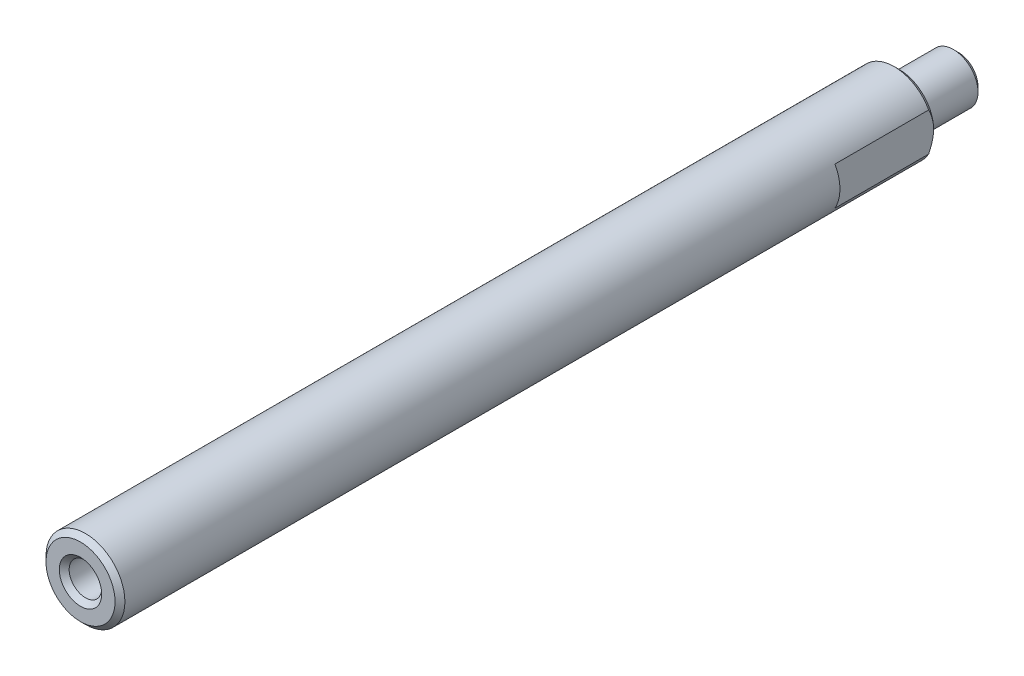
ISO-10303-21;
HEADER;
FILE_DESCRIPTION(('STEP AP214'),'2;1');
FILE_NAME('part.step','',(''),(''),'','','');
FILE_SCHEMA(('AUTOMOTIVE_DESIGN { 1 0 10303 214 1 1 1 1 }'));
ENDSEC;
DATA;
#1=APPLICATION_CONTEXT('core data for automotive mechanical design processes');
#2=APPLICATION_PROTOCOL_DEFINITION('international standard','automotive_design',2000,#1);
#3=PRODUCT_CONTEXT('',#1,'mechanical');
#4=PRODUCT('Part','Part','',(#3));
#5=PRODUCT_RELATED_PRODUCT_CATEGORY('part','',(#4));
#6=PRODUCT_DEFINITION_FORMATION('','',#4);
#7=PRODUCT_DEFINITION_CONTEXT('part definition',#1,'design');
#8=PRODUCT_DEFINITION('design','',#6,#7);
#9=PRODUCT_DEFINITION_SHAPE('','',#8);
#10=(LENGTH_UNIT() NAMED_UNIT(*) SI_UNIT(.MILLI.,.METRE.));
#11=(NAMED_UNIT(*) PLANE_ANGLE_UNIT() SI_UNIT($,.RADIAN.));
#12=(NAMED_UNIT(*) SI_UNIT($,.STERADIAN.) SOLID_ANGLE_UNIT());
#13=UNCERTAINTY_MEASURE_WITH_UNIT(LENGTH_MEASURE(1.E-05),#10,'distance_accuracy_value','');
#14=(GEOMETRIC_REPRESENTATION_CONTEXT(3) GLOBAL_UNCERTAINTY_ASSIGNED_CONTEXT((#13)) GLOBAL_UNIT_ASSIGNED_CONTEXT((#10,
#11,#12)) REPRESENTATION_CONTEXT('',''));
#15=CARTESIAN_POINT('',(0.,0.,0.));
#16=DIRECTION('',(0.,0.,1.));
#17=DIRECTION('',(1.,0.,0.));
#18=AXIS2_PLACEMENT_3D('',#15,#16,#17);
#19=CARTESIAN_POINT('',(0.,0.,41.5));
#20=DIRECTION('',(0.,0.,-1.));
#21=DIRECTION('',(-1.,0.,0.));
#22=AXIS2_PLACEMENT_3D('',#19,#20,#21);
#23=CYLINDRICAL_SURFACE('',#22,4.);
#24=CARTESIAN_POINT('',(0.,0.,41.));
#25=DIRECTION('',(0.,0.,1.));
#26=DIRECTION('',(1.,0.,0.));
#27=AXIS2_PLACEMENT_3D('',#24,#25,#26);
#28=CIRCLE('',#27,4.);
#29=CARTESIAN_POINT('',(4.,0.,41.));
#30=VERTEX_POINT('',#29);
#31=EDGE_CURVE('E212',#30,#30,#28,.F.);
#32=ORIENTED_EDGE('',*,*,#31,.T.);
#33=EDGE_LOOP('',(#32));
#34=FACE_BOUND('',#33,.T.);
#35=DIRECTION('',(0.,0.,-1.));
#36=VECTOR('',#35,1.);
#37=CARTESIAN_POINT('',(3.5,-1.9364916731037,41.5));
#38=LINE('',#37,#36);
#39=CARTESIAN_POINT('',(3.5,-1.9364916731037,-31.5));
#40=VERTEX_POINT('',#39);
#41=CARTESIAN_POINT('',(3.5,-1.9364916731037,-41.));
#42=VERTEX_POINT('',#41);
#43=EDGE_CURVE('E54',#40,#42,#38,.T.);
#44=ORIENTED_EDGE('',*,*,#43,.F.);
#45=CARTESIAN_POINT('',(0.,0.,-31.5));
#46=DIRECTION('',(0.,0.,-1.));
#47=DIRECTION('',(-1.,0.,0.));
#48=AXIS2_PLACEMENT_3D('',#45,#46,#47);
#49=CIRCLE('',#48,4.);
#50=CARTESIAN_POINT('',(3.5,1.9364916731037,-31.5));
#51=VERTEX_POINT('',#50);
#52=EDGE_CURVE('E12',#51,#40,#49,.T.);
#53=ORIENTED_EDGE('',*,*,#52,.F.);
#54=DIRECTION('',(0.,0.,-1.));
#55=VECTOR('',#54,1.);
#56=CARTESIAN_POINT('',(3.5,1.9364916731037,41.5));
#57=LINE('',#56,#55);
#58=CARTESIAN_POINT('',(3.5,1.9364916731037,-41.));
#59=VERTEX_POINT('',#58);
#60=EDGE_CURVE('E216',#59,#51,#57,.F.);
#61=ORIENTED_EDGE('',*,*,#60,.F.);
#62=CARTESIAN_POINT('',(0.,0.,-41.));
#63=DIRECTION('',(0.,0.,1.));
#64=DIRECTION('',(1.,0.,0.));
#65=AXIS2_PLACEMENT_3D('',#62,#63,#64);
#66=CIRCLE('',#65,4.);
#67=CARTESIAN_POINT('',(-3.5,1.93649167310371,-41.));
#68=VERTEX_POINT('',#67);
#69=EDGE_CURVE('E226',#59,#68,#66,.T.);
#70=ORIENTED_EDGE('',*,*,#69,.T.);
#71=DIRECTION('',(0.,0.,-1.));
#72=VECTOR('',#71,1.);
#73=CARTESIAN_POINT('',(-3.5,1.93649167310371,41.5));
#74=LINE('',#73,#72);
#75=CARTESIAN_POINT('',(-3.5,1.93649167310371,-31.5));
#76=VERTEX_POINT('',#75);
#77=EDGE_CURVE('E62',#76,#68,#74,.T.);
#78=ORIENTED_EDGE('',*,*,#77,.F.);
#79=CARTESIAN_POINT('',(-3.5,-1.93649167310371,-31.5));
#80=VERTEX_POINT('',#79);
#81=EDGE_CURVE('E42',#80,#76,#49,.T.);
#82=ORIENTED_EDGE('',*,*,#81,.F.);
#83=DIRECTION('',(0.,0.,-1.));
#84=VECTOR('',#83,1.);
#85=CARTESIAN_POINT('',(-3.5,-1.93649167310371,41.5));
#86=LINE('',#85,#84);
#87=CARTESIAN_POINT('',(-3.5,-1.93649167310371,-41.));
#88=VERTEX_POINT('',#87);
#89=EDGE_CURVE('E380',#88,#80,#86,.F.);
#90=ORIENTED_EDGE('',*,*,#89,.F.);
#91=EDGE_CURVE('E108',#88,#42,#66,.T.);
#92=ORIENTED_EDGE('',*,*,#91,.T.);
#93=EDGE_LOOP('',(#44,#53,#61,#70,#78,#82,#90,#92));
#94=FACE_BOUND('',#93,.T.);
#95=ADVANCED_FACE('F38',(#34,#94),#23,.T.);
#96=CARTESIAN_POINT('',(0.,0.,-41.));
#97=DIRECTION('',(0.,0.,1.));
#98=DIRECTION('',(1.,0.,0.));
#99=AXIS2_PLACEMENT_3D('',#96,#97,#98);
#100=CONICAL_SURFACE('',#99,4.,0.785398163397452);
#101=ORIENTED_EDGE('',*,*,#69,.F.);
#102=CARTESIAN_POINT('',(3.5,-9.72210903936668,-34.6670718490191));
#103=CARTESIAN_POINT('',(3.5,-9.49675211064801,-34.8790856585773));
#104=CARTESIAN_POINT('',(3.5,-9.27099231094285,-35.0906736922465));
#105=CARTESIAN_POINT('',(3.5,-8.81842756725486,-35.5127515712037));
#106=CARTESIAN_POINT('',(3.5,-8.59162257118305,-35.7232413606196));
#107=CARTESIAN_POINT('',(3.5,-8.13615417064803,-36.1434049845079));
#108=CARTESIAN_POINT('',(3.5,-7.90748745213978,-36.3530752308568));
#109=CARTESIAN_POINT('',(3.5,-7.44856584906267,-36.7706582096246));
#110=CARTESIAN_POINT('',(3.5,-7.21831101159906,-36.978570993768));
#111=CARTESIAN_POINT('',(3.5,-6.73153732718403,-37.4137980850977));
#112=CARTESIAN_POINT('',(3.5,-6.4747945212575,-37.6408625848898));
#113=CARTESIAN_POINT('',(3.5,-5.95796755736317,-38.0912163016094));
#114=CARTESIAN_POINT('',(3.5,-5.69788306972896,-38.3145051409457));
#115=CARTESIAN_POINT('',(3.5,-5.17352708652992,-38.7553920310412));
#116=CARTESIAN_POINT('',(3.5,-4.90926203646296,-38.9729976873293));
#117=CARTESIAN_POINT('',(3.5,-4.50804554212314,-39.293331154235));
#118=CARTESIAN_POINT('',(3.5,-4.37351434945404,-39.3990883783864));
#119=CARTESIAN_POINT('',(3.5,-4.10249597774295,-39.6080616240559));
#120=CARTESIAN_POINT('',(3.5,-3.96600889731747,-39.7112777729878));
#121=CARTESIAN_POINT('',(3.5,-3.71955655661411,-39.8931688346747));
#122=CARTESIAN_POINT('',(3.5,-3.61003757011149,-39.9724475435073));
#123=CARTESIAN_POINT('',(3.5,-3.38925853302415,-40.1285552376567));
#124=CARTESIAN_POINT('',(3.5,-3.27799844240285,-40.2053841665173));
#125=CARTESIAN_POINT('',(3.5,-3.05325526524606,-40.3561427853941));
#126=CARTESIAN_POINT('',(3.5,-2.93976880945707,-40.430067475336));
#127=CARTESIAN_POINT('',(3.5,-2.71041345142017,-40.5741246353902));
#128=CARTESIAN_POINT('',(3.5,-2.59454463915492,-40.6442572483691));
#129=CARTESIAN_POINT('',(3.5,-2.36249800612877,-40.7783149642523));
#130=CARTESIAN_POINT('',(3.5,-2.24637880478079,-40.8423401412331));
#131=CARTESIAN_POINT('',(3.5,-2.01114153261681,-40.9645847696923));
#132=CARTESIAN_POINT('',(3.5,-1.89202284482296,-41.0228030142951));
#133=CARTESIAN_POINT('',(3.5,-1.53026384341005,-41.1861364671056));
#134=CARTESIAN_POINT('',(3.5,-1.28230287962176,-41.2804876126618));
#135=CARTESIAN_POINT('',(3.5,-0.941110328216121,-41.376640165047));
#136=CARTESIAN_POINT('',(3.5,-0.853426401202402,-41.3984883890347));
#137=CARTESIAN_POINT('',(3.5,-0.676753886145511,-41.4362166615991));
#138=CARTESIAN_POINT('',(3.5,-0.587765202846983,-41.4520962721527));
#139=CARTESIAN_POINT('',(3.5,-0.409132501465646,-41.4772739868802));
#140=CARTESIAN_POINT('',(3.5,-0.319491339673619,-41.4865921773776));
#141=CARTESIAN_POINT('',(3.5,-0.139759004257694,-41.4983589362354));
#142=CARTESIAN_POINT('',(3.5,-0.0496678434785235,-41.5008076995663));
#143=CARTESIAN_POINT('',(3.5,0.146139164453281,-41.4985448805346));
#144=CARTESIAN_POINT('',(3.5,0.251841939974333,-41.4925111392872));
#145=CARTESIAN_POINT('',(3.5,0.462305858552493,-41.471154085203));
#146=CARTESIAN_POINT('',(3.5,0.567066809225415,-41.455828916302));
#147=CARTESIAN_POINT('',(3.5,0.7761757193874,-41.4164576404524));
#148=CARTESIAN_POINT('',(3.5,0.880504759745505,-41.3923123392633));
#149=CARTESIAN_POINT('',(3.5,1.08705946102245,-41.3364216801614));
#150=CARTESIAN_POINT('',(3.5,1.18928546716526,-41.3046775806175));
#151=CARTESIAN_POINT('',(3.5,1.40656532714047,-41.2295177507355));
#152=CARTESIAN_POINT('',(3.5,1.52125855795074,-41.1850673913918));
#153=CARTESIAN_POINT('',(3.5,1.74772415566107,-41.0892450679126));
#154=CARTESIAN_POINT('',(3.5,1.85949553685278,-41.0378708030245));
#155=CARTESIAN_POINT('',(3.5,2.08066253269893,-40.929393329946));
#156=CARTESIAN_POINT('',(3.5,2.1900490122497,-40.8722716410328));
#157=CARTESIAN_POINT('',(3.5,2.40633114801255,-40.7535591120014));
#158=CARTESIAN_POINT('',(3.5,2.5132271867341,-40.6919689642572));
#159=CARTESIAN_POINT('',(3.5,2.7203607561847,-40.5678691585214));
#160=CARTESIAN_POINT('',(3.5,2.82068844136306,-40.5055091938584));
#161=CARTESIAN_POINT('',(3.5,3.01960915511366,-40.378072868458));
#162=CARTESIAN_POINT('',(3.5,3.11820204555932,-40.3129962927992));
#163=CARTESIAN_POINT('',(3.5,3.3130783586339,-40.181144069427));
#164=CARTESIAN_POINT('',(3.5,3.40937401499202,-40.1143864373407));
#165=CARTESIAN_POINT('',(3.5,3.60063111206643,-39.9790414084471));
#166=CARTESIAN_POINT('',(3.5,3.6955929252504,-39.9104545386003));
#167=CARTESIAN_POINT('',(3.5,3.78999464238315,-39.8411183974341));
#168=B_SPLINE_CURVE_WITH_KNOTS('',3,(#102,#103,#104,#105,#106,#107,#108,#109,#110,#111,#112,
#113,#114,#115,#116,#117,#118,#119,#120,#121,#122,#123,#124,#125,#126,#127,#128,#129,#130,#131,
#132,#133,#134,#135,#136,#137,#138,#139,#140,#141,#142,#143,#144,#145,#146,#147,#148,#149,#150,
#151,#152,#153,#154,#155,#156,#157,#158,#159,#160,#161,#162,#163,#164,#165,#166,#167),
.UNSPECIFIED.,.F.,.F.,(4,2,2,2,2,2,2,2,2,2,2,2,2,2,2,2,2,2,2,2,2,2,2,2,2,2,2,2,2,2,2,2,4),(0.,
0.928237034591131,1.85652084069288,2.78723937896321,3.71793042887286,4.74614144498124,
5.77445468799038,6.80131283977318,7.31466100996613,7.82798338741159,8.23356182192887,
8.63914959644451,9.04540751227226,9.451650111641,9.84928096276884,10.2469942834989,
11.0392123882106,11.3101444267395,11.5810963444732,11.8512151542963,12.1213262974392,
12.4385082405398,12.7557535650903,13.0766824818616,13.397558289198,13.7662891836754,
14.1351429076684,14.5052230676275,14.8752460067726,15.2295810703108,15.5839442199519,
15.9354391559696,16.2868339055349),.UNSPECIFIED.);
#169=CARTESIAN_POINT('',(3.5,0.,-41.5));
#170=VERTEX_POINT('',#169);
#171=EDGE_CURVE('E114',#59,#170,#168,.F.);
#172=ORIENTED_EDGE('',*,*,#171,.T.);
#173=CARTESIAN_POINT('',(0.,0.,-41.5));
#174=DIRECTION('',(0.,0.,1.));
#175=DIRECTION('',(1.,0.,0.));
#176=AXIS2_PLACEMENT_3D('',#173,#174,#175);
#177=CIRCLE('',#176,3.50000000000001);
#178=CARTESIAN_POINT('',(-3.5,0.,-41.5));
#179=VERTEX_POINT('',#178);
#180=EDGE_CURVE('E112',#179,#170,#177,.F.);
#181=ORIENTED_EDGE('',*,*,#180,.F.);
#182=CARTESIAN_POINT('',(-3.5,-9.72210903936668,-34.6670718490191));
#183=CARTESIAN_POINT('',(-3.5,-9.49675211064801,-34.8790856585773));
#184=CARTESIAN_POINT('',(-3.5,-9.27099231094284,-35.0906736922465));
#185=CARTESIAN_POINT('',(-3.5,-8.81842756725485,-35.5127515712037));
#186=CARTESIAN_POINT('',(-3.5,-8.59162257118305,-35.7232413606196));
#187=CARTESIAN_POINT('',(-3.5,-8.13615417064802,-36.1434049845079));
#188=CARTESIAN_POINT('',(-3.5,-7.90748745213977,-36.3530752308568));
#189=CARTESIAN_POINT('',(-3.5,-7.44856584906267,-36.7706582096246));
#190=CARTESIAN_POINT('',(-3.5,-7.21831101159907,-36.978570993768));
#191=CARTESIAN_POINT('',(-3.5,-6.73153732718402,-37.4137980850977));
#192=CARTESIAN_POINT('',(-3.5,-6.4747945212575,-37.6408625848898));
#193=CARTESIAN_POINT('',(-3.5,-5.95796755736316,-38.0912163016094));
#194=CARTESIAN_POINT('',(-3.5,-5.69788306972895,-38.3145051409458));
#195=CARTESIAN_POINT('',(-3.5,-5.1735270865299,-38.7553920310412));
#196=CARTESIAN_POINT('',(-3.5,-4.90926203646294,-38.9729976873293));
#197=CARTESIAN_POINT('',(-3.5,-4.50804554212312,-39.293331154235));
#198=CARTESIAN_POINT('',(-3.5,-4.37351434945401,-39.3990883783864));
#199=CARTESIAN_POINT('',(-3.5,-4.10249597774292,-39.608061624056));
#200=CARTESIAN_POINT('',(-3.5,-3.96600889731745,-39.7112777729878));
#201=CARTESIAN_POINT('',(-3.5,-3.71955655661409,-39.8931688346747));
#202=CARTESIAN_POINT('',(-3.5,-3.61003757011147,-39.9724475435073));
#203=CARTESIAN_POINT('',(-3.5,-3.38925853302414,-40.1285552376567));
#204=CARTESIAN_POINT('',(-3.5,-3.27799844240283,-40.2053841665173));
#205=CARTESIAN_POINT('',(-3.5,-3.05325526524604,-40.3561427853941));
#206=CARTESIAN_POINT('',(-3.5,-2.93976880945706,-40.430067475336));
#207=CARTESIAN_POINT('',(-3.5,-2.71041345142015,-40.5741246353902));
#208=CARTESIAN_POINT('',(-3.5,-2.59454463915491,-40.6442572483691));
#209=CARTESIAN_POINT('',(-3.5,-2.36249800612876,-40.7783149642523));
#210=CARTESIAN_POINT('',(-3.5,-2.24637880478078,-40.8423401412331));
#211=CARTESIAN_POINT('',(-3.5,-2.0111415326168,-40.9645847696923));
#212=CARTESIAN_POINT('',(-3.5,-1.89202284482296,-41.0228030142951));
#213=CARTESIAN_POINT('',(-3.5,-1.53026384341005,-41.1861364671056));
#214=CARTESIAN_POINT('',(-3.5,-1.28230287962177,-41.2804876126618));
#215=CARTESIAN_POINT('',(-3.5,-0.941110328216126,-41.3766401650471));
#216=CARTESIAN_POINT('',(-3.5,-0.853426401202406,-41.3984883890347));
#217=CARTESIAN_POINT('',(-3.5,-0.676753886145514,-41.4362166615991));
#218=CARTESIAN_POINT('',(-3.5,-0.587765202846985,-41.4520962721527));
#219=CARTESIAN_POINT('',(-3.5,-0.409132501465648,-41.4772739868802));
#220=CARTESIAN_POINT('',(-3.5,-0.319491339673621,-41.4865921773776));
#221=CARTESIAN_POINT('',(-3.5,-0.139759004257695,-41.4983589362354));
#222=CARTESIAN_POINT('',(-3.5,-0.0496678434785235,-41.5008076995663));
#223=CARTESIAN_POINT('',(-3.5,0.146139164453281,-41.4985448805346));
#224=CARTESIAN_POINT('',(-3.5,0.251841939974334,-41.4925111392872));
#225=CARTESIAN_POINT('',(-3.5,0.462305858552493,-41.471154085203));
#226=CARTESIAN_POINT('',(-3.5,0.567066809225415,-41.455828916302));
#227=CARTESIAN_POINT('',(-3.5,0.7761757193874,-41.4164576404524));
#228=CARTESIAN_POINT('',(-3.5,0.880504759745504,-41.3923123392633));
#229=CARTESIAN_POINT('',(-3.5,1.08705946102245,-41.3364216801614));
#230=CARTESIAN_POINT('',(-3.5,1.18928546716526,-41.3046775806175));
#231=CARTESIAN_POINT('',(-3.5,1.40656532714048,-41.2295177507356));
#232=CARTESIAN_POINT('',(-3.5,1.52125855795075,-41.1850673913918));
#233=CARTESIAN_POINT('',(-3.5,1.74772415566107,-41.0892450679126));
#234=CARTESIAN_POINT('',(-3.5,1.85949553685279,-41.0378708030245));
#235=CARTESIAN_POINT('',(-3.5,2.08066253269893,-40.929393329946));
#236=CARTESIAN_POINT('',(-3.5,2.1900490122497,-40.8722716410328));
#237=CARTESIAN_POINT('',(-3.5,2.40633114801256,-40.7535591120015));
#238=CARTESIAN_POINT('',(-3.5,2.5132271867341,-40.6919689642572));
#239=CARTESIAN_POINT('',(-3.5,2.72036075618471,-40.5678691585214));
#240=CARTESIAN_POINT('',(-3.5,2.82068844136306,-40.5055091938584));
#241=CARTESIAN_POINT('',(-3.5,3.01960915511367,-40.378072868458));
#242=CARTESIAN_POINT('',(-3.5,3.11820204555933,-40.3129962927992));
#243=CARTESIAN_POINT('',(-3.5,3.3130783586339,-40.181144069427));
#244=CARTESIAN_POINT('',(-3.5,3.40937401499202,-40.1143864373407));
#245=CARTESIAN_POINT('',(-3.5,3.60063111206643,-39.9790414084471));
#246=CARTESIAN_POINT('',(-3.5,3.6955929252504,-39.9104545386003));
#247=CARTESIAN_POINT('',(-3.5,3.78999464238315,-39.8411183974341));
#248=B_SPLINE_CURVE_WITH_KNOTS('',3,(#182,#183,#184,#185,#186,#187,#188,#189,#190,#191,#192,
#193,#194,#195,#196,#197,#198,#199,#200,#201,#202,#203,#204,#205,#206,#207,#208,#209,#210,#211,
#212,#213,#214,#215,#216,#217,#218,#219,#220,#221,#222,#223,#224,#225,#226,#227,#228,#229,#230,
#231,#232,#233,#234,#235,#236,#237,#238,#239,#240,#241,#242,#243,#244,#245,#246,#247),
.UNSPECIFIED.,.F.,.F.,(4,2,2,2,2,2,2,2,2,2,2,2,2,2,2,2,2,2,2,2,2,2,2,2,2,2,2,2,2,2,2,2,4),(0.,
0.928237034591136,1.85652084069288,2.7872393789632,3.71793042887285,4.74614144498124,
5.7744546879904,6.8013128397732,7.31466100996616,7.82798338741162,8.23356182192888,
8.63914959644453,9.04540751227227,9.45165011164101,9.84928096276884,10.2469942834989,
11.0392123882105,11.3101444267395,11.5810963444732,11.8512151542963,12.1213262974392,
12.4385082405398,12.7557535650903,13.0766824818616,13.397558289198,13.7662891836754,
14.1351429076684,14.5052230676275,14.8752460067726,15.2295810703108,15.5839442199519,
15.9354391559696,16.2868339055349),.UNSPECIFIED.);
#249=EDGE_CURVE('E90',#179,#68,#248,.T.);
#250=ORIENTED_EDGE('',*,*,#249,.T.);
#251=EDGE_LOOP('',(#101,#172,#181,#250));
#252=FACE_BOUND('',#251,.T.);
#253=ADVANCED_FACE('F113',(#252),#100,.T.);
#254=EDGE_CURVE('E106',#170,#179,#177,.F.);
#255=ORIENTED_EDGE('',*,*,#254,.F.);
#256=EDGE_CURVE('E109',#170,#42,#168,.F.);
#257=ORIENTED_EDGE('',*,*,#256,.T.);
#258=ORIENTED_EDGE('',*,*,#91,.F.);
#259=EDGE_CURVE('E93',#88,#179,#248,.T.);
#260=ORIENTED_EDGE('',*,*,#259,.T.);
#261=EDGE_LOOP('',(#255,#257,#258,#260));
#262=FACE_BOUND('',#261,.T.);
#263=ADVANCED_FACE('F104',(#262),#100,.T.);
#264=CARTESIAN_POINT('',(0.,0.,-41.5));
#265=DIRECTION('',(0.,0.,1.));
#266=DIRECTION('',(1.,0.,0.));
#267=AXIS2_PLACEMENT_3D('',#264,#265,#266);
#268=PLANE('',#267);
#269=ORIENTED_EDGE('',*,*,#254,.T.);
#270=ORIENTED_EDGE('',*,*,#180,.T.);
#271=EDGE_LOOP('',(#269,#270));
#272=FACE_BOUND('',#271,.T.);
#273=CARTESIAN_POINT('',(0.,0.,-41.5));
#274=DIRECTION('',(0.,0.,1.));
#275=DIRECTION('',(1.,0.,0.));
#276=AXIS2_PLACEMENT_3D('',#273,#274,#275);
#277=CIRCLE('',#276,2.5);
#278=CARTESIAN_POINT('',(2.5,0.,-41.5));
#279=VERTEX_POINT('',#278);
#280=EDGE_CURVE('E135',#279,#279,#277,.F.);
#281=ORIENTED_EDGE('',*,*,#280,.F.);
#282=EDGE_LOOP('',(#281));
#283=FACE_BOUND('',#282,.T.);
#284=ADVANCED_FACE('F118',(#272,#283),#268,.F.);
#285=CARTESIAN_POINT('',(0.,0.,41.5));
#286=DIRECTION('',(0.,0.,1.));
#287=DIRECTION('',(1.,0.,0.));
#288=AXIS2_PLACEMENT_3D('',#285,#286,#287);
#289=PLANE('',#288);
#290=CARTESIAN_POINT('',(0.,0.,41.5));
#291=DIRECTION('',(0.,0.,1.));
#292=DIRECTION('',(1.,0.,0.));
#293=AXIS2_PLACEMENT_3D('',#290,#291,#292);
#294=CIRCLE('',#293,3.50000000000002);
#295=CARTESIAN_POINT('',(3.50000000000002,0.,41.5));
#296=VERTEX_POINT('',#295);
#297=EDGE_CURVE('E129',#296,#296,#294,.T.);
#298=ORIENTED_EDGE('',*,*,#297,.T.);
#299=EDGE_LOOP('',(#298));
#300=FACE_BOUND('',#299,.T.);
#301=CARTESIAN_POINT('',(0.,0.,41.5));
#302=DIRECTION('',(0.,0.,1.));
#303=DIRECTION('',(1.,0.,0.));
#304=AXIS2_PLACEMENT_3D('',#301,#302,#303);
#305=CIRCLE('',#304,2.15);
#306=CARTESIAN_POINT('',(2.15,0.,41.5));
#307=VERTEX_POINT('',#306);
#308=EDGE_CURVE('E122',#307,#307,#305,.F.);
#309=ORIENTED_EDGE('',*,*,#308,.T.);
#310=EDGE_LOOP('',(#309));
#311=FACE_BOUND('',#310,.T.);
#312=ADVANCED_FACE('F190',(#300,#311),#289,.T.);
#313=CARTESIAN_POINT('',(0.,0.,29.4));
#314=DIRECTION('',(0.,0.,1.));
#315=DIRECTION('',(1.,0.,0.));
#316=AXIS2_PLACEMENT_3D('',#313,#314,#315);
#317=CONICAL_SURFACE('',#316,1.65,1.02974425867665);
#318=CARTESIAN_POINT('',(0.,0.,28.4085799786045));
#319=VERTEX_POINT('',#318);
#320=VERTEX_LOOP('',#319);
#321=FACE_BOUND('',#320,.T.);
#322=CARTESIAN_POINT('',(0.,0.,29.4));
#323=DIRECTION('',(0.,0.,1.));
#324=DIRECTION('',(1.,0.,0.));
#325=AXIS2_PLACEMENT_3D('',#322,#323,#324);
#326=CIRCLE('',#325,1.65);
#327=CARTESIAN_POINT('',(1.65,0.,29.4));
#328=VERTEX_POINT('',#327);
#329=EDGE_CURVE('E215',#328,#328,#326,.T.);
#330=ORIENTED_EDGE('',*,*,#329,.T.);
#331=EDGE_LOOP('',(#330));
#332=FACE_BOUND('',#331,.T.);
#333=ADVANCED_FACE('F186',(#321,#332),#317,.F.);
#334=CARTESIAN_POINT('',(0.,0.,41.5));
#335=DIRECTION('',(0.,0.,1.));
#336=DIRECTION('',(1.,0.,0.));
#337=AXIS2_PLACEMENT_3D('',#334,#335,#336);
#338=CYLINDRICAL_SURFACE('',#337,1.65);
#339=CARTESIAN_POINT('',(0.,0.,41.));
#340=DIRECTION('',(0.,0.,1.));
#341=DIRECTION('',(1.,0.,0.));
#342=AXIS2_PLACEMENT_3D('',#339,#340,#341);
#343=CIRCLE('',#342,1.65);
#344=CARTESIAN_POINT('',(1.65,0.,41.));
#345=VERTEX_POINT('',#344);
#346=EDGE_CURVE('E132',#345,#345,#343,.T.);
#347=ORIENTED_EDGE('',*,*,#346,.T.);
#348=EDGE_LOOP('',(#347));
#349=FACE_BOUND('',#348,.T.);
#350=ORIENTED_EDGE('',*,*,#329,.F.);
#351=EDGE_LOOP('',(#350));
#352=FACE_BOUND('',#351,.T.);
#353=ADVANCED_FACE('F182',(#349,#352),#338,.F.);
#354=CARTESIAN_POINT('',(0.,0.,41.5));
#355=DIRECTION('',(0.,0.,-1.));
#356=DIRECTION('',(-1.,0.,0.));
#357=AXIS2_PLACEMENT_3D('',#354,#355,#356);
#358=CONICAL_SURFACE('',#357,3.50000000000002,0.785398163397438);
#359=ORIENTED_EDGE('',*,*,#31,.F.);
#360=EDGE_LOOP('',(#359));
#361=FACE_BOUND('',#360,.T.);
#362=ORIENTED_EDGE('',*,*,#297,.F.);
#363=EDGE_LOOP('',(#362));
#364=FACE_BOUND('',#363,.T.);
#365=ADVANCED_FACE('F185',(#361,#364),#358,.T.);
#366=CARTESIAN_POINT('',(0.,0.,41.));
#367=DIRECTION('',(0.,0.,1.));
#368=DIRECTION('',(1.,0.,0.));
#369=AXIS2_PLACEMENT_3D('',#366,#367,#368);
#370=CONICAL_SURFACE('',#369,1.65,0.785398163397449);
#371=ORIENTED_EDGE('',*,*,#308,.F.);
#372=EDGE_LOOP('',(#371));
#373=FACE_BOUND('',#372,.T.);
#374=ORIENTED_EDGE('',*,*,#346,.F.);
#375=EDGE_LOOP('',(#374));
#376=FACE_BOUND('',#375,.T.);
#377=ADVANCED_FACE('F180',(#373,#376),#370,.F.);
#378=CARTESIAN_POINT('',(0.,0.,-47.5));
#379=DIRECTION('',(0.,0.,1.));
#380=DIRECTION('',(1.,0.,0.));
#381=AXIS2_PLACEMENT_3D('',#378,#379,#380);
#382=CYLINDRICAL_SURFACE('',#381,2.5);
#383=CARTESIAN_POINT('',(0.,0.,-47.));
#384=DIRECTION('',(0.,0.,-1.));
#385=DIRECTION('',(-1.,0.,0.));
#386=AXIS2_PLACEMENT_3D('',#383,#384,#385);
#387=CIRCLE('',#386,2.5);
#388=CARTESIAN_POINT('',(-2.5,0.,-47.));
#389=VERTEX_POINT('',#388);
#390=EDGE_CURVE('E99',#389,#389,#387,.F.);
#391=ORIENTED_EDGE('',*,*,#390,.T.);
#392=EDGE_LOOP('',(#391));
#393=FACE_BOUND('',#392,.T.);
#394=ORIENTED_EDGE('',*,*,#280,.T.);
#395=EDGE_LOOP('',(#394));
#396=FACE_BOUND('',#395,.T.);
#397=ADVANCED_FACE('F170',(#393,#396),#382,.T.);
#398=CARTESIAN_POINT('',(0.,0.,-47.5));
#399=DIRECTION('',(0.,0.,-1.));
#400=DIRECTION('',(-1.,0.,0.));
#401=AXIS2_PLACEMENT_3D('',#398,#399,#400);
#402=PLANE('',#401);
#403=CARTESIAN_POINT('',(0.,0.,-47.5));
#404=DIRECTION('',(0.,0.,-1.));
#405=DIRECTION('',(-1.,0.,0.));
#406=AXIS2_PLACEMENT_3D('',#403,#404,#405);
#407=CIRCLE('',#406,2.);
#408=CARTESIAN_POINT('',(-2.,0.,-47.5));
#409=VERTEX_POINT('',#408);
#410=EDGE_CURVE('E138',#409,#409,#407,.T.);
#411=ORIENTED_EDGE('',*,*,#410,.T.);
#412=EDGE_LOOP('',(#411));
#413=FACE_BOUND('',#412,.T.);
#414=ADVANCED_FACE('F167',(#413),#402,.T.);
#415=CARTESIAN_POINT('',(0.,0.,-47.5));
#416=DIRECTION('',(0.,0.,1.));
#417=DIRECTION('',(1.,0.,0.));
#418=AXIS2_PLACEMENT_3D('',#415,#416,#417);
#419=CONICAL_SURFACE('',#418,2.,0.785398163397453);
#420=ORIENTED_EDGE('',*,*,#390,.F.);
#421=EDGE_LOOP('',(#420));
#422=FACE_BOUND('',#421,.T.);
#423=ORIENTED_EDGE('',*,*,#410,.F.);
#424=EDGE_LOOP('',(#423));
#425=FACE_BOUND('',#424,.T.);
#426=ADVANCED_FACE('F40',(#422,#425),#419,.T.);
#427=CARTESIAN_POINT('',(-3.5,-5.1784626126303,-31.5));
#428=DIRECTION('',(-1.,0.,0.));
#429=DIRECTION('',(0.,0.,1.));
#430=AXIS2_PLACEMENT_3D('',#427,#428,#429);
#431=PLANE('',#430);
#432=ORIENTED_EDGE('',*,*,#77,.T.);
#433=ORIENTED_EDGE('',*,*,#249,.F.);
#434=ORIENTED_EDGE('',*,*,#259,.F.);
#435=ORIENTED_EDGE('',*,*,#89,.T.);
#436=DIRECTION('',(0.,1.,0.));
#437=VECTOR('',#436,1.);
#438=CARTESIAN_POINT('',(-3.5,-5.1784626126303,-31.5));
#439=LINE('',#438,#437);
#440=EDGE_CURVE('E379',#80,#76,#439,.T.);
#441=ORIENTED_EDGE('',*,*,#440,.T.);
#442=EDGE_LOOP('',(#432,#433,#434,#435,#441));
#443=FACE_BOUND('',#442,.T.);
#444=ADVANCED_FACE('F92',(#443),#431,.T.);
#445=CARTESIAN_POINT('',(0.,0.,-31.5));
#446=DIRECTION('',(0.,0.,-1.));
#447=DIRECTION('',(-1.,0.,0.));
#448=AXIS2_PLACEMENT_3D('',#445,#446,#447);
#449=PLANE('',#448);
#450=ORIENTED_EDGE('',*,*,#81,.T.);
#451=ORIENTED_EDGE('',*,*,#440,.F.);
#452=EDGE_LOOP('',(#450,#451));
#453=FACE_BOUND('',#452,.T.);
#454=ADVANCED_FACE('F158',(#453),#449,.T.);
#455=ORIENTED_EDGE('',*,*,#52,.T.);
#456=DIRECTION('',(0.,-1.,0.));
#457=VECTOR('',#456,1.);
#458=CARTESIAN_POINT('',(3.5,-5.1784626126303,-31.5));
#459=LINE('',#458,#457);
#460=EDGE_CURVE('E381',#51,#40,#459,.T.);
#461=ORIENTED_EDGE('',*,*,#460,.F.);
#462=EDGE_LOOP('',(#455,#461));
#463=FACE_BOUND('',#462,.T.);
#464=ADVANCED_FACE('F163',(#463),#449,.T.);
#465=CARTESIAN_POINT('',(3.5,-5.1784626126303,-31.5));
#466=DIRECTION('',(1.,0.,0.));
#467=DIRECTION('',(0.,0.,-1.));
#468=AXIS2_PLACEMENT_3D('',#465,#466,#467);
#469=PLANE('',#468);
#470=ORIENTED_EDGE('',*,*,#43,.T.);
#471=ORIENTED_EDGE('',*,*,#256,.F.);
#472=ORIENTED_EDGE('',*,*,#171,.F.);
#473=ORIENTED_EDGE('',*,*,#60,.T.);
#474=ORIENTED_EDGE('',*,*,#460,.T.);
#475=EDGE_LOOP('',(#470,#471,#472,#473,#474));
#476=FACE_BOUND('',#475,.T.);
#477=ADVANCED_FACE('F159',(#476),#469,.T.);
#478=CLOSED_SHELL('',(#95,#253,#263,#284,#312,#333,#353,#365,#377,#397,#414,#426,#444,#454,#464,#477));
#479=CARTESIAN_POINT('',(0.,0.,-41.5));
#480=DIRECTION('',(0.,0.,-1.));
#481=DIRECTION('',(-1.,0.,0.));
#482=AXIS2_PLACEMENT_3D('',#479,#480,#481);
#483=PLANE('',#482);
#484=CARTESIAN_POINT('',(0.,0.,-41.5));
#485=DIRECTION('',(0.,0.,1.));
#486=DIRECTION('',(1.,0.,0.));
#487=AXIS2_PLACEMENT_3D('',#484,#485,#486);
#488=CIRCLE('',#487,2.15);
#489=CARTESIAN_POINT('',(2.15,0.,-41.5));
#490=VERTEX_POINT('',#489);
#491=EDGE_CURVE('E116',#490,#490,#488,.T.);
#492=ORIENTED_EDGE('',*,*,#491,.T.);
#493=EDGE_LOOP('',(#492));
#494=FACE_BOUND('',#493,.T.);
#495=ADVANCED_FACE('F172',(#494),#483,.F.);
#496=CARTESIAN_POINT('',(0.,0.,-29.4));
#497=DIRECTION('',(0.,0.,-1.));
#498=DIRECTION('',(-1.,0.,0.));
#499=AXIS2_PLACEMENT_3D('',#496,#497,#498);
#500=CONICAL_SURFACE('',#499,1.65,1.02974425867665);
#501=CARTESIAN_POINT('',(0.,0.,-28.4085799786045));
#502=VERTEX_POINT('',#501);
#503=VERTEX_LOOP('',#502);
#504=FACE_BOUND('',#503,.T.);
#505=CARTESIAN_POINT('',(0.,0.,-29.4));
#506=DIRECTION('',(0.,0.,-1.));
#507=DIRECTION('',(-1.,0.,0.));
#508=AXIS2_PLACEMENT_3D('',#505,#506,#507);
#509=CIRCLE('',#508,1.65);
#510=CARTESIAN_POINT('',(-1.65,0.,-29.4));
#511=VERTEX_POINT('',#510);
#512=EDGE_CURVE('E219',#511,#511,#509,.T.);
#513=ORIENTED_EDGE('',*,*,#512,.T.);
#514=EDGE_LOOP('',(#513));
#515=FACE_BOUND('',#514,.T.);
#516=ADVANCED_FACE('F175',(#504,#515),#500,.F.);
#517=CARTESIAN_POINT('',(0.,0.,-41.5));
#518=DIRECTION('',(0.,0.,-1.));
#519=DIRECTION('',(-1.,0.,0.));
#520=AXIS2_PLACEMENT_3D('',#517,#518,#519);
#521=CYLINDRICAL_SURFACE('',#520,1.65);
#522=CARTESIAN_POINT('',(0.,0.,-41.));
#523=DIRECTION('',(0.,0.,1.));
#524=DIRECTION('',(1.,0.,0.));
#525=AXIS2_PLACEMENT_3D('',#522,#523,#524);
#526=CIRCLE('',#525,1.65);
#527=CARTESIAN_POINT('',(1.65,0.,-41.));
#528=VERTEX_POINT('',#527);
#529=EDGE_CURVE('E120',#528,#528,#526,.F.);
#530=ORIENTED_EDGE('',*,*,#529,.T.);
#531=EDGE_LOOP('',(#530));
#532=FACE_BOUND('',#531,.T.);
#533=ORIENTED_EDGE('',*,*,#512,.F.);
#534=EDGE_LOOP('',(#533));
#535=FACE_BOUND('',#534,.T.);
#536=ADVANCED_FACE('F192',(#532,#535),#521,.F.);
#537=CARTESIAN_POINT('',(0.,0.,-41.));
#538=DIRECTION('',(0.,0.,-1.));
#539=DIRECTION('',(-1.,0.,0.));
#540=AXIS2_PLACEMENT_3D('',#537,#538,#539);
#541=CONICAL_SURFACE('',#540,1.65,0.785398163397449);
#542=ORIENTED_EDGE('',*,*,#491,.F.);
#543=EDGE_LOOP('',(#542));
#544=FACE_BOUND('',#543,.T.);
#545=ORIENTED_EDGE('',*,*,#529,.F.);
#546=EDGE_LOOP('',(#545));
#547=FACE_BOUND('',#546,.T.);
#548=ADVANCED_FACE('F195',(#544,#547),#541,.F.);
#549=CLOSED_SHELL('',(#495,#516,#536,#548));
#550=ORIENTED_CLOSED_SHELL('',*,#549,.T.);
#551=BREP_WITH_VOIDS('B2',#478,(#550));
#552=ADVANCED_BREP_SHAPE_REPRESENTATION('',(#18,#551),#14);
#553=SHAPE_DEFINITION_REPRESENTATION(#9,#552);
ENDSEC;
END-ISO-10303-21;
